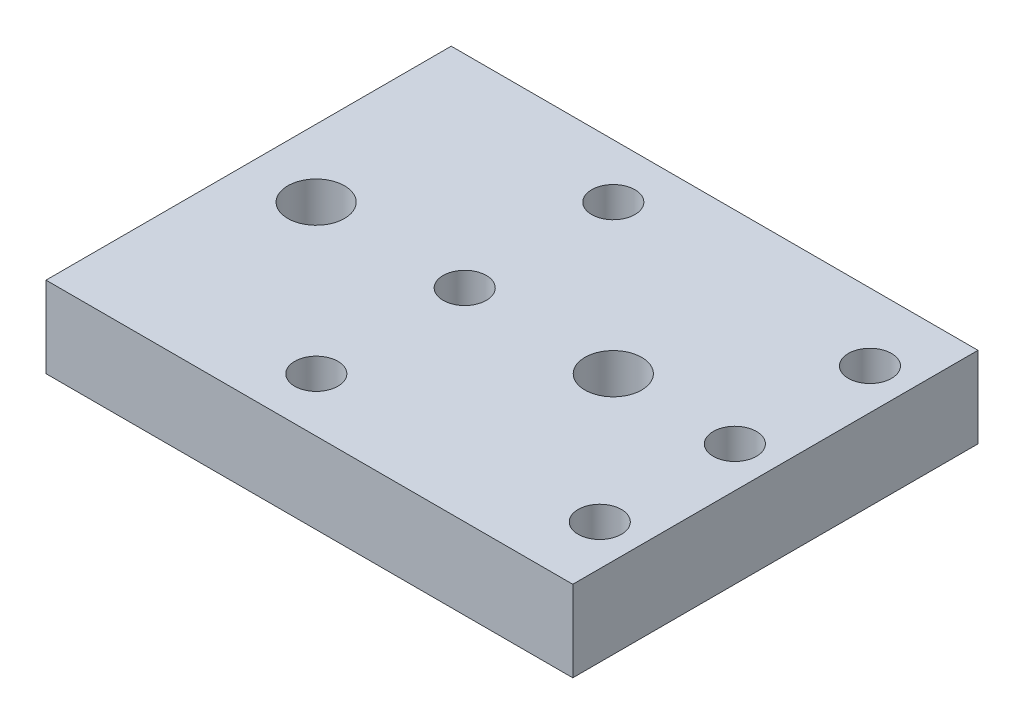
ISO-10303-21;
HEADER;
FILE_DESCRIPTION(('STEP AP214'),'2;1');
FILE_NAME('part.step','',(''),(''),'','','');
FILE_SCHEMA(('AUTOMOTIVE_DESIGN { 1 0 10303 214 1 1 1 1 }'));
ENDSEC;
DATA;
#1=APPLICATION_CONTEXT('core data for automotive mechanical design processes');
#2=APPLICATION_PROTOCOL_DEFINITION('international standard','automotive_design',2000,#1);
#3=PRODUCT_CONTEXT('',#1,'mechanical');
#4=PRODUCT('Part','Part','',(#3));
#5=PRODUCT_RELATED_PRODUCT_CATEGORY('part','',(#4));
#6=PRODUCT_DEFINITION_FORMATION('','',#4);
#7=PRODUCT_DEFINITION_CONTEXT('part definition',#1,'design');
#8=PRODUCT_DEFINITION('design','',#6,#7);
#9=PRODUCT_DEFINITION_SHAPE('','',#8);
#10=(LENGTH_UNIT() NAMED_UNIT(*) SI_UNIT(.MILLI.,.METRE.));
#11=(NAMED_UNIT(*) PLANE_ANGLE_UNIT() SI_UNIT($,.RADIAN.));
#12=(NAMED_UNIT(*) SI_UNIT($,.STERADIAN.) SOLID_ANGLE_UNIT());
#13=UNCERTAINTY_MEASURE_WITH_UNIT(LENGTH_MEASURE(1.E-05),#10,'distance_accuracy_value','');
#14=(GEOMETRIC_REPRESENTATION_CONTEXT(3) GLOBAL_UNCERTAINTY_ASSIGNED_CONTEXT((#13)) GLOBAL_UNIT_ASSIGNED_CONTEXT((#10,
#11,#12)) REPRESENTATION_CONTEXT('',''));
#15=CARTESIAN_POINT('',(0.,0.,0.));
#16=DIRECTION('',(0.,0.,1.));
#17=DIRECTION('',(1.,0.,0.));
#18=AXIS2_PLACEMENT_3D('',#15,#16,#17);
#19=CARTESIAN_POINT('',(0.,6.,0.));
#20=DIRECTION('',(0.,-1.,0.));
#21=DIRECTION('',(0.,0.,-1.));
#22=AXIS2_PLACEMENT_3D('',#19,#20,#21);
#23=PLANE('',#22);
#24=DIRECTION('',(0.,0.,1.));
#25=VECTOR('',#24,1.);
#26=CARTESIAN_POINT('',(0.,6.,0.));
#27=LINE('',#26,#25);
#28=CARTESIAN_POINT('',(0.,6.,-30.));
#29=VERTEX_POINT('',#28);
#30=CARTESIAN_POINT('',(0.,6.,0.));
#31=VERTEX_POINT('',#30);
#32=EDGE_CURVE('E90',#29,#31,#27,.T.);
#33=ORIENTED_EDGE('',*,*,#32,.T.);
#34=DIRECTION('',(1.,0.,0.));
#35=VECTOR('',#34,1.);
#36=CARTESIAN_POINT('',(0.,6.,0.));
#37=LINE('',#36,#35);
#38=CARTESIAN_POINT('',(39.,6.,0.));
#39=VERTEX_POINT('',#38);
#40=EDGE_CURVE('E85',#31,#39,#37,.T.);
#41=ORIENTED_EDGE('',*,*,#40,.T.);
#42=DIRECTION('',(0.,0.,-1.));
#43=VECTOR('',#42,1.);
#44=CARTESIAN_POINT('',(39.,6.,0.));
#45=LINE('',#44,#43);
#46=CARTESIAN_POINT('',(39.,6.,-30.));
#47=VERTEX_POINT('',#46);
#48=EDGE_CURVE('E88',#39,#47,#45,.T.);
#49=ORIENTED_EDGE('',*,*,#48,.T.);
#50=DIRECTION('',(-1.,0.,0.));
#51=VECTOR('',#50,1.);
#52=CARTESIAN_POINT('',(0.,6.,-30.));
#53=LINE('',#52,#51);
#54=EDGE_CURVE('E55',#47,#29,#53,.T.);
#55=ORIENTED_EDGE('',*,*,#54,.T.);
#56=EDGE_LOOP('',(#33,#41,#49,#55));
#57=FACE_BOUND('',#56,.T.);
#58=CARTESIAN_POINT('',(16.,6.,-15.));
#59=DIRECTION('',(0.,1.,0.));
#60=DIRECTION('',(0.,0.,1.));
#61=AXIS2_PLACEMENT_3D('',#58,#59,#60);
#62=CIRCLE('',#61,1.6);
#63=CARTESIAN_POINT('',(16.,6.,-13.4));
#64=VERTEX_POINT('',#63);
#65=EDGE_CURVE('E105',#64,#64,#62,.T.);
#66=ORIENTED_EDGE('',*,*,#65,.F.);
#67=EDGE_LOOP('',(#66));
#68=FACE_BOUND('',#67,.T.);
#69=CARTESIAN_POINT('',(16.,6.,-26.));
#70=DIRECTION('',(0.,1.,0.));
#71=DIRECTION('',(0.,0.,1.));
#72=AXIS2_PLACEMENT_3D('',#69,#70,#71);
#73=CIRCLE('',#72,1.6);
#74=CARTESIAN_POINT('',(16.,6.,-24.4));
#75=VERTEX_POINT('',#74);
#76=EDGE_CURVE('E120',#75,#75,#73,.T.);
#77=ORIENTED_EDGE('',*,*,#76,.F.);
#78=EDGE_LOOP('',(#77));
#79=FACE_BOUND('',#78,.T.);
#80=CARTESIAN_POINT('',(5.,6.,-15.));
#81=DIRECTION('',(0.,1.,0.));
#82=DIRECTION('',(0.,0.,1.));
#83=AXIS2_PLACEMENT_3D('',#80,#81,#82);
#84=CIRCLE('',#83,2.1);
#85=CARTESIAN_POINT('',(5.,6.,-12.9));
#86=VERTEX_POINT('',#85);
#87=EDGE_CURVE('E126',#86,#86,#84,.T.);
#88=ORIENTED_EDGE('',*,*,#87,.F.);
#89=EDGE_LOOP('',(#88));
#90=FACE_BOUND('',#89,.T.);
#91=CARTESIAN_POINT('',(16.0107922704545,6.,-4.00000529423316));
#92=DIRECTION('',(0.,1.,0.));
#93=DIRECTION('',(0.,0.,-1.));
#94=AXIS2_PLACEMENT_3D('',#91,#92,#93);
#95=CIRCLE('',#94,1.6);
#96=CARTESIAN_POINT('',(16.0107922704545,6.,-5.60000529423316));
#97=VERTEX_POINT('',#96);
#98=EDGE_CURVE('E132',#97,#97,#95,.T.);
#99=ORIENTED_EDGE('',*,*,#98,.F.);
#100=EDGE_LOOP('',(#99));
#101=FACE_BOUND('',#100,.T.);
#102=CARTESIAN_POINT('',(27.,6.,-15.));
#103=DIRECTION('',(0.,1.,0.));
#104=DIRECTION('',(0.,0.,-1.));
#105=AXIS2_PLACEMENT_3D('',#102,#103,#104);
#106=CIRCLE('',#105,2.1);
#107=CARTESIAN_POINT('',(27.,6.,-17.1));
#108=VERTEX_POINT('',#107);
#109=EDGE_CURVE('E138',#108,#108,#106,.T.);
#110=ORIENTED_EDGE('',*,*,#109,.F.);
#111=EDGE_LOOP('',(#110));
#112=FACE_BOUND('',#111,.T.);
#113=CARTESIAN_POINT('',(36.,6.,-25.));
#114=DIRECTION('',(0.,1.,0.));
#115=DIRECTION('',(0.,0.,1.));
#116=AXIS2_PLACEMENT_3D('',#113,#114,#115);
#117=CIRCLE('',#116,1.6);
#118=CARTESIAN_POINT('',(36.,6.,-23.4));
#119=VERTEX_POINT('',#118);
#120=EDGE_CURVE('E144',#119,#119,#117,.T.);
#121=ORIENTED_EDGE('',*,*,#120,.F.);
#122=EDGE_LOOP('',(#121));
#123=FACE_BOUND('',#122,.T.);
#124=CARTESIAN_POINT('',(36.0000000000001,6.,-15.));
#125=DIRECTION('',(0.,1.,0.));
#126=DIRECTION('',(0.,0.,1.));
#127=AXIS2_PLACEMENT_3D('',#124,#125,#126);
#128=CIRCLE('',#127,1.6);
#129=CARTESIAN_POINT('',(36.0000000000001,6.,-13.4));
#130=VERTEX_POINT('',#129);
#131=EDGE_CURVE('E150',#130,#130,#128,.T.);
#132=ORIENTED_EDGE('',*,*,#131,.F.);
#133=EDGE_LOOP('',(#132));
#134=FACE_BOUND('',#133,.T.);
#135=CARTESIAN_POINT('',(36.0000000000002,6.,-5.));
#136=DIRECTION('',(0.,1.,0.));
#137=DIRECTION('',(0.,0.,1.));
#138=AXIS2_PLACEMENT_3D('',#135,#136,#137);
#139=CIRCLE('',#138,1.6);
#140=CARTESIAN_POINT('',(36.0000000000002,6.,-3.4));
#141=VERTEX_POINT('',#140);
#142=EDGE_CURVE('E156',#141,#141,#139,.T.);
#143=ORIENTED_EDGE('',*,*,#142,.F.);
#144=EDGE_LOOP('',(#143));
#145=FACE_BOUND('',#144,.T.);
#146=ADVANCED_FACE('F38',(#57,#68,#79,#90,#101,#112,#123,#134,#145),#23,.F.);
#147=CARTESIAN_POINT('',(0.,0.,0.));
#148=DIRECTION('',(0.,-1.,0.));
#149=DIRECTION('',(0.,0.,-1.));
#150=AXIS2_PLACEMENT_3D('',#147,#148,#149);
#151=PLANE('',#150);
#152=CARTESIAN_POINT('',(36.0000000000001,0.,-15.));
#153=DIRECTION('',(0.,1.,0.));
#154=DIRECTION('',(0.,0.,1.));
#155=AXIS2_PLACEMENT_3D('',#152,#153,#154);
#156=CIRCLE('',#155,1.6);
#157=CARTESIAN_POINT('',(36.0000000000001,0.,-13.4));
#158=VERTEX_POINT('',#157);
#159=EDGE_CURVE('E153',#158,#158,#156,.T.);
#160=ORIENTED_EDGE('',*,*,#159,.T.);
#161=EDGE_LOOP('',(#160));
#162=FACE_BOUND('',#161,.T.);
#163=CARTESIAN_POINT('',(27.,0.,-15.));
#164=DIRECTION('',(0.,1.,0.));
#165=DIRECTION('',(0.,0.,-1.));
#166=AXIS2_PLACEMENT_3D('',#163,#164,#165);
#167=CIRCLE('',#166,2.1);
#168=CARTESIAN_POINT('',(27.,0.,-17.1));
#169=VERTEX_POINT('',#168);
#170=EDGE_CURVE('E141',#169,#169,#167,.T.);
#171=ORIENTED_EDGE('',*,*,#170,.T.);
#172=EDGE_LOOP('',(#171));
#173=FACE_BOUND('',#172,.T.);
#174=CARTESIAN_POINT('',(5.,0.,-15.));
#175=DIRECTION('',(0.,1.,0.));
#176=DIRECTION('',(0.,0.,1.));
#177=AXIS2_PLACEMENT_3D('',#174,#175,#176);
#178=CIRCLE('',#177,2.1);
#179=CARTESIAN_POINT('',(5.,0.,-12.9));
#180=VERTEX_POINT('',#179);
#181=EDGE_CURVE('E129',#180,#180,#178,.T.);
#182=ORIENTED_EDGE('',*,*,#181,.T.);
#183=EDGE_LOOP('',(#182));
#184=FACE_BOUND('',#183,.T.);
#185=CARTESIAN_POINT('',(16.,0.,-15.));
#186=DIRECTION('',(0.,1.,0.));
#187=DIRECTION('',(0.,0.,1.));
#188=AXIS2_PLACEMENT_3D('',#185,#186,#187);
#189=CIRCLE('',#188,1.6);
#190=CARTESIAN_POINT('',(16.,0.,-13.4));
#191=VERTEX_POINT('',#190);
#192=EDGE_CURVE('E117',#191,#191,#189,.T.);
#193=ORIENTED_EDGE('',*,*,#192,.T.);
#194=EDGE_LOOP('',(#193));
#195=FACE_BOUND('',#194,.T.);
#196=DIRECTION('',(0.,0.,1.));
#197=VECTOR('',#196,1.);
#198=CARTESIAN_POINT('',(0.,0.,0.));
#199=LINE('',#198,#197);
#200=CARTESIAN_POINT('',(0.,0.,-30.));
#201=VERTEX_POINT('',#200);
#202=CARTESIAN_POINT('',(0.,0.,0.));
#203=VERTEX_POINT('',#202);
#204=EDGE_CURVE('E102',#201,#203,#199,.T.);
#205=ORIENTED_EDGE('',*,*,#204,.F.);
#206=DIRECTION('',(-1.,0.,0.));
#207=VECTOR('',#206,1.);
#208=CARTESIAN_POINT('',(0.,0.,-30.));
#209=LINE('',#208,#207);
#210=CARTESIAN_POINT('',(39.,0.,-30.));
#211=VERTEX_POINT('',#210);
#212=EDGE_CURVE('E78',#211,#201,#209,.T.);
#213=ORIENTED_EDGE('',*,*,#212,.F.);
#214=DIRECTION('',(0.,0.,-1.));
#215=VECTOR('',#214,1.);
#216=CARTESIAN_POINT('',(39.,0.,0.));
#217=LINE('',#216,#215);
#218=CARTESIAN_POINT('',(39.,0.,0.));
#219=VERTEX_POINT('',#218);
#220=EDGE_CURVE('E72',#219,#211,#217,.T.);
#221=ORIENTED_EDGE('',*,*,#220,.F.);
#222=DIRECTION('',(1.,0.,0.));
#223=VECTOR('',#222,1.);
#224=CARTESIAN_POINT('',(0.,0.,0.));
#225=LINE('',#224,#223);
#226=EDGE_CURVE('E94',#203,#219,#225,.T.);
#227=ORIENTED_EDGE('',*,*,#226,.F.);
#228=EDGE_LOOP('',(#205,#213,#221,#227));
#229=FACE_BOUND('',#228,.T.);
#230=CARTESIAN_POINT('',(16.,0.,-26.));
#231=DIRECTION('',(0.,1.,0.));
#232=DIRECTION('',(0.,0.,1.));
#233=AXIS2_PLACEMENT_3D('',#230,#231,#232);
#234=CIRCLE('',#233,1.6);
#235=CARTESIAN_POINT('',(16.,0.,-24.4));
#236=VERTEX_POINT('',#235);
#237=EDGE_CURVE('E123',#236,#236,#234,.T.);
#238=ORIENTED_EDGE('',*,*,#237,.T.);
#239=EDGE_LOOP('',(#238));
#240=FACE_BOUND('',#239,.T.);
#241=CARTESIAN_POINT('',(16.0107922704545,0.,-4.00000529423316));
#242=DIRECTION('',(0.,1.,0.));
#243=DIRECTION('',(0.,0.,-1.));
#244=AXIS2_PLACEMENT_3D('',#241,#242,#243);
#245=CIRCLE('',#244,1.6);
#246=CARTESIAN_POINT('',(16.0107922704545,0.,-5.60000529423316));
#247=VERTEX_POINT('',#246);
#248=EDGE_CURVE('E135',#247,#247,#245,.T.);
#249=ORIENTED_EDGE('',*,*,#248,.T.);
#250=EDGE_LOOP('',(#249));
#251=FACE_BOUND('',#250,.T.);
#252=CARTESIAN_POINT('',(36.,0.,-25.));
#253=DIRECTION('',(0.,1.,0.));
#254=DIRECTION('',(0.,0.,1.));
#255=AXIS2_PLACEMENT_3D('',#252,#253,#254);
#256=CIRCLE('',#255,1.6);
#257=CARTESIAN_POINT('',(36.,0.,-23.4));
#258=VERTEX_POINT('',#257);
#259=EDGE_CURVE('E147',#258,#258,#256,.T.);
#260=ORIENTED_EDGE('',*,*,#259,.T.);
#261=EDGE_LOOP('',(#260));
#262=FACE_BOUND('',#261,.T.);
#263=CARTESIAN_POINT('',(36.0000000000002,0.,-5.));
#264=DIRECTION('',(0.,1.,0.));
#265=DIRECTION('',(0.,0.,1.));
#266=AXIS2_PLACEMENT_3D('',#263,#264,#265);
#267=CIRCLE('',#266,1.6);
#268=CARTESIAN_POINT('',(36.0000000000002,0.,-3.4));
#269=VERTEX_POINT('',#268);
#270=EDGE_CURVE('E159',#269,#269,#267,.T.);
#271=ORIENTED_EDGE('',*,*,#270,.T.);
#272=EDGE_LOOP('',(#271));
#273=FACE_BOUND('',#272,.T.);
#274=ADVANCED_FACE('F113',(#162,#173,#184,#195,#229,#240,#251,#262,#273),#151,.T.);
#275=CARTESIAN_POINT('',(0.,6.,0.));
#276=DIRECTION('',(1.,0.,0.));
#277=DIRECTION('',(0.,0.,-1.));
#278=AXIS2_PLACEMENT_3D('',#275,#276,#277);
#279=PLANE('',#278);
#280=ORIENTED_EDGE('',*,*,#204,.T.);
#281=DIRECTION('',(0.,-1.,0.));
#282=VECTOR('',#281,1.);
#283=CARTESIAN_POINT('',(0.,6.,0.));
#284=LINE('',#283,#282);
#285=EDGE_CURVE('E11',#31,#203,#284,.T.);
#286=ORIENTED_EDGE('',*,*,#285,.F.);
#287=ORIENTED_EDGE('',*,*,#32,.F.);
#288=DIRECTION('',(0.,-1.,0.));
#289=VECTOR('',#288,1.);
#290=CARTESIAN_POINT('',(0.,6.,-30.));
#291=LINE('',#290,#289);
#292=EDGE_CURVE('E98',#29,#201,#291,.T.);
#293=ORIENTED_EDGE('',*,*,#292,.T.);
#294=EDGE_LOOP('',(#280,#286,#287,#293));
#295=FACE_BOUND('',#294,.T.);
#296=ADVANCED_FACE('F40',(#295),#279,.F.);
#297=CARTESIAN_POINT('',(0.,6.,0.));
#298=DIRECTION('',(0.,0.,-1.));
#299=DIRECTION('',(-1.,0.,0.));
#300=AXIS2_PLACEMENT_3D('',#297,#298,#299);
#301=PLANE('',#300);
#302=ORIENTED_EDGE('',*,*,#226,.T.);
#303=DIRECTION('',(0.,-1.,0.));
#304=VECTOR('',#303,1.);
#305=CARTESIAN_POINT('',(39.,6.,0.));
#306=LINE('',#305,#304);
#307=EDGE_CURVE('E47',#39,#219,#306,.T.);
#308=ORIENTED_EDGE('',*,*,#307,.F.);
#309=ORIENTED_EDGE('',*,*,#40,.F.);
#310=ORIENTED_EDGE('',*,*,#285,.T.);
#311=EDGE_LOOP('',(#302,#308,#309,#310));
#312=FACE_BOUND('',#311,.T.);
#313=ADVANCED_FACE('F93',(#312),#301,.F.);
#314=CARTESIAN_POINT('',(39.,6.,0.));
#315=DIRECTION('',(-1.,0.,0.));
#316=DIRECTION('',(0.,0.,1.));
#317=AXIS2_PLACEMENT_3D('',#314,#315,#316);
#318=PLANE('',#317);
#319=ORIENTED_EDGE('',*,*,#220,.T.);
#320=DIRECTION('',(0.,-1.,0.));
#321=VECTOR('',#320,1.);
#322=CARTESIAN_POINT('',(39.,6.,-30.));
#323=LINE('',#322,#321);
#324=EDGE_CURVE('E95',#47,#211,#323,.T.);
#325=ORIENTED_EDGE('',*,*,#324,.F.);
#326=ORIENTED_EDGE('',*,*,#48,.F.);
#327=ORIENTED_EDGE('',*,*,#307,.T.);
#328=EDGE_LOOP('',(#319,#325,#326,#327));
#329=FACE_BOUND('',#328,.T.);
#330=ADVANCED_FACE('F96',(#329),#318,.F.);
#331=CARTESIAN_POINT('',(0.,6.,-30.));
#332=DIRECTION('',(0.,0.,1.));
#333=DIRECTION('',(1.,0.,0.));
#334=AXIS2_PLACEMENT_3D('',#331,#332,#333);
#335=PLANE('',#334);
#336=ORIENTED_EDGE('',*,*,#212,.T.);
#337=ORIENTED_EDGE('',*,*,#292,.F.);
#338=ORIENTED_EDGE('',*,*,#54,.F.);
#339=ORIENTED_EDGE('',*,*,#324,.T.);
#340=EDGE_LOOP('',(#336,#337,#338,#339));
#341=FACE_BOUND('',#340,.T.);
#342=ADVANCED_FACE('F110',(#341),#335,.F.);
#343=CARTESIAN_POINT('',(16.,6.,-15.));
#344=DIRECTION('',(0.,-1.,0.));
#345=DIRECTION('',(0.,0.,-1.));
#346=AXIS2_PLACEMENT_3D('',#343,#344,#345);
#347=CYLINDRICAL_SURFACE('',#346,1.6);
#348=ORIENTED_EDGE('',*,*,#65,.T.);
#349=EDGE_LOOP('',(#348));
#350=FACE_BOUND('',#349,.T.);
#351=ORIENTED_EDGE('',*,*,#192,.F.);
#352=EDGE_LOOP('',(#351));
#353=FACE_BOUND('',#352,.T.);
#354=ADVANCED_FACE('F176',(#350,#353),#347,.F.);
#355=CARTESIAN_POINT('',(16.,6.,-26.));
#356=DIRECTION('',(0.,-1.,0.));
#357=DIRECTION('',(0.,0.,-1.));
#358=AXIS2_PLACEMENT_3D('',#355,#356,#357);
#359=CYLINDRICAL_SURFACE('',#358,1.6);
#360=ORIENTED_EDGE('',*,*,#76,.T.);
#361=EDGE_LOOP('',(#360));
#362=FACE_BOUND('',#361,.T.);
#363=ORIENTED_EDGE('',*,*,#237,.F.);
#364=EDGE_LOOP('',(#363));
#365=FACE_BOUND('',#364,.T.);
#366=ADVANCED_FACE('F230',(#362,#365),#359,.F.);
#367=CARTESIAN_POINT('',(5.,6.,-15.));
#368=DIRECTION('',(0.,-1.,0.));
#369=DIRECTION('',(0.,0.,-1.));
#370=AXIS2_PLACEMENT_3D('',#367,#368,#369);
#371=CYLINDRICAL_SURFACE('',#370,2.1);
#372=ORIENTED_EDGE('',*,*,#87,.T.);
#373=EDGE_LOOP('',(#372));
#374=FACE_BOUND('',#373,.T.);
#375=ORIENTED_EDGE('',*,*,#181,.F.);
#376=EDGE_LOOP('',(#375));
#377=FACE_BOUND('',#376,.T.);
#378=ADVANCED_FACE('F239',(#374,#377),#371,.F.);
#379=CARTESIAN_POINT('',(16.0107922704545,6.,-4.00000529423316));
#380=DIRECTION('',(0.,-1.,0.));
#381=DIRECTION('',(0.,0.,-1.));
#382=AXIS2_PLACEMENT_3D('',#379,#380,#381);
#383=CYLINDRICAL_SURFACE('',#382,1.6);
#384=ORIENTED_EDGE('',*,*,#98,.T.);
#385=EDGE_LOOP('',(#384));
#386=FACE_BOUND('',#385,.T.);
#387=ORIENTED_EDGE('',*,*,#248,.F.);
#388=EDGE_LOOP('',(#387));
#389=FACE_BOUND('',#388,.T.);
#390=ADVANCED_FACE('F248',(#386,#389),#383,.F.);
#391=CARTESIAN_POINT('',(27.,6.,-15.));
#392=DIRECTION('',(0.,-1.,0.));
#393=DIRECTION('',(0.,0.,-1.));
#394=AXIS2_PLACEMENT_3D('',#391,#392,#393);
#395=CYLINDRICAL_SURFACE('',#394,2.1);
#396=ORIENTED_EDGE('',*,*,#109,.T.);
#397=EDGE_LOOP('',(#396));
#398=FACE_BOUND('',#397,.T.);
#399=ORIENTED_EDGE('',*,*,#170,.F.);
#400=EDGE_LOOP('',(#399));
#401=FACE_BOUND('',#400,.T.);
#402=ADVANCED_FACE('F258',(#398,#401),#395,.F.);
#403=CARTESIAN_POINT('',(36.,6.,-25.));
#404=DIRECTION('',(0.,-1.,0.));
#405=DIRECTION('',(0.,0.,-1.));
#406=AXIS2_PLACEMENT_3D('',#403,#404,#405);
#407=CYLINDRICAL_SURFACE('',#406,1.6);
#408=ORIENTED_EDGE('',*,*,#120,.T.);
#409=EDGE_LOOP('',(#408));
#410=FACE_BOUND('',#409,.T.);
#411=ORIENTED_EDGE('',*,*,#259,.F.);
#412=EDGE_LOOP('',(#411));
#413=FACE_BOUND('',#412,.T.);
#414=ADVANCED_FACE('F268',(#410,#413),#407,.F.);
#415=CARTESIAN_POINT('',(36.0000000000001,6.,-15.));
#416=DIRECTION('',(0.,-1.,0.));
#417=DIRECTION('',(0.,0.,-1.));
#418=AXIS2_PLACEMENT_3D('',#415,#416,#417);
#419=CYLINDRICAL_SURFACE('',#418,1.6);
#420=ORIENTED_EDGE('',*,*,#131,.T.);
#421=EDGE_LOOP('',(#420));
#422=FACE_BOUND('',#421,.T.);
#423=ORIENTED_EDGE('',*,*,#159,.F.);
#424=EDGE_LOOP('',(#423));
#425=FACE_BOUND('',#424,.T.);
#426=ADVANCED_FACE('F278',(#422,#425),#419,.F.);
#427=CARTESIAN_POINT('',(36.0000000000002,6.,-5.));
#428=DIRECTION('',(0.,-1.,0.));
#429=DIRECTION('',(0.,0.,-1.));
#430=AXIS2_PLACEMENT_3D('',#427,#428,#429);
#431=CYLINDRICAL_SURFACE('',#430,1.6);
#432=ORIENTED_EDGE('',*,*,#142,.T.);
#433=EDGE_LOOP('',(#432));
#434=FACE_BOUND('',#433,.T.);
#435=ORIENTED_EDGE('',*,*,#270,.F.);
#436=EDGE_LOOP('',(#435));
#437=FACE_BOUND('',#436,.T.);
#438=ADVANCED_FACE('F165',(#434,#437),#431,.F.);
#439=CLOSED_SHELL('',(#146,#274,#296,#313,#330,#342,#354,#366,#378,#390,#402,#414,#426,#438));
#440=MANIFOLD_SOLID_BREP('B2',#439);
#441=ADVANCED_BREP_SHAPE_REPRESENTATION('',(#18,#440),#14);
#442=SHAPE_DEFINITION_REPRESENTATION(#9,#441);
ENDSEC;
END-ISO-10303-21;
